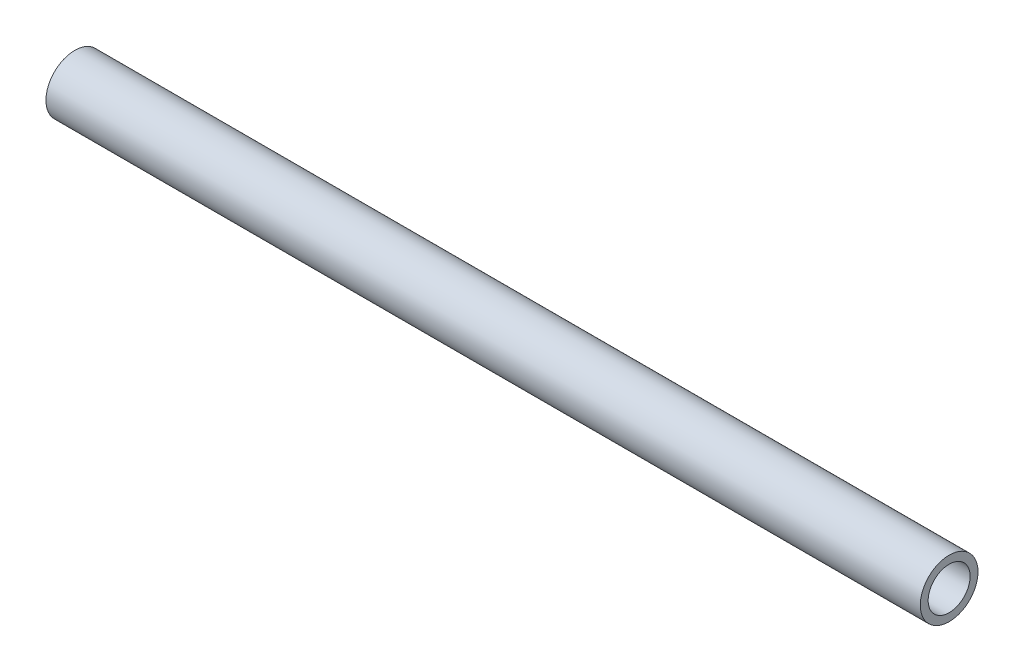
ISO-10303-21;
HEADER;
FILE_DESCRIPTION(('STEP AP214'),'2;1');
FILE_NAME('part.step','',(''),(''),'','','');
FILE_SCHEMA(('AUTOMOTIVE_DESIGN { 1 0 10303 214 1 1 1 1 }'));
ENDSEC;
DATA;
#1=APPLICATION_CONTEXT('core data for automotive mechanical design processes');
#2=APPLICATION_PROTOCOL_DEFINITION('international standard','automotive_design',2000,#1);
#3=PRODUCT_CONTEXT('',#1,'mechanical');
#4=PRODUCT('Part','Part','',(#3));
#5=PRODUCT_RELATED_PRODUCT_CATEGORY('part','',(#4));
#6=PRODUCT_DEFINITION_FORMATION('','',#4);
#7=PRODUCT_DEFINITION_CONTEXT('part definition',#1,'design');
#8=PRODUCT_DEFINITION('design','',#6,#7);
#9=PRODUCT_DEFINITION_SHAPE('','',#8);
#10=(LENGTH_UNIT() NAMED_UNIT(*) SI_UNIT(.MILLI.,.METRE.));
#11=(NAMED_UNIT(*) PLANE_ANGLE_UNIT() SI_UNIT($,.RADIAN.));
#12=(NAMED_UNIT(*) SI_UNIT($,.STERADIAN.) SOLID_ANGLE_UNIT());
#13=UNCERTAINTY_MEASURE_WITH_UNIT(LENGTH_MEASURE(1.E-05),#10,'distance_accuracy_value','');
#14=(GEOMETRIC_REPRESENTATION_CONTEXT(3) GLOBAL_UNCERTAINTY_ASSIGNED_CONTEXT((#13)) GLOBAL_UNIT_ASSIGNED_CONTEXT((#10,
#11,#12)) REPRESENTATION_CONTEXT('',''));
#15=CARTESIAN_POINT('',(0.,0.,0.));
#16=DIRECTION('',(0.,0.,1.));
#17=DIRECTION('',(1.,0.,0.));
#18=AXIS2_PLACEMENT_3D('',#15,#16,#17);
#19=CARTESIAN_POINT('',(125.,0.,0.));
#20=DIRECTION('',(1.,0.,0.));
#21=DIRECTION('',(0.,0.,-1.));
#22=AXIS2_PLACEMENT_3D('',#19,#20,#21);
#23=PLANE('',#22);
#24=CARTESIAN_POINT('',(125.,0.,0.));
#25=DIRECTION('',(1.,0.,0.));
#26=DIRECTION('',(0.,0.,-1.));
#27=AXIS2_PLACEMENT_3D('',#24,#25,#26);
#28=CIRCLE('',#27,4.125);
#29=CARTESIAN_POINT('',(125.,0.,-4.125));
#30=VERTEX_POINT('',#29);
#31=EDGE_CURVE('E10',#30,#30,#28,.T.);
#32=ORIENTED_EDGE('',*,*,#31,.T.);
#33=EDGE_LOOP('',(#32));
#34=FACE_BOUND('',#33,.T.);
#35=CARTESIAN_POINT('',(125.,0.,0.));
#36=DIRECTION('',(1.,0.,0.));
#37=DIRECTION('',(0.,0.,-1.));
#38=AXIS2_PLACEMENT_3D('',#35,#36,#37);
#39=CIRCLE('',#38,3.);
#40=CARTESIAN_POINT('',(125.,0.,-3.));
#41=VERTEX_POINT('',#40);
#42=EDGE_CURVE('E42',#41,#41,#39,.T.);
#43=ORIENTED_EDGE('',*,*,#42,.F.);
#44=EDGE_LOOP('',(#43));
#45=FACE_BOUND('',#44,.T.);
#46=ADVANCED_FACE('F31',(#34,#45),#23,.T.);
#47=CARTESIAN_POINT('',(0.,0.,0.));
#48=DIRECTION('',(1.,0.,0.));
#49=DIRECTION('',(0.,0.,-1.));
#50=AXIS2_PLACEMENT_3D('',#47,#48,#49);
#51=PLANE('',#50);
#52=CARTESIAN_POINT('',(0.,0.,0.));
#53=DIRECTION('',(1.,0.,0.));
#54=DIRECTION('',(0.,0.,-1.));
#55=AXIS2_PLACEMENT_3D('',#52,#53,#54);
#56=CIRCLE('',#55,4.125);
#57=CARTESIAN_POINT('',(0.,0.,-4.125));
#58=VERTEX_POINT('',#57);
#59=EDGE_CURVE('E35',#58,#58,#56,.T.);
#60=ORIENTED_EDGE('',*,*,#59,.F.);
#61=EDGE_LOOP('',(#60));
#62=FACE_BOUND('',#61,.T.);
#63=CARTESIAN_POINT('',(0.,0.,0.));
#64=DIRECTION('',(1.,0.,0.));
#65=DIRECTION('',(0.,0.,-1.));
#66=AXIS2_PLACEMENT_3D('',#63,#64,#65);
#67=CIRCLE('',#66,3.);
#68=CARTESIAN_POINT('',(0.,0.,-3.));
#69=VERTEX_POINT('',#68);
#70=EDGE_CURVE('E44',#69,#69,#67,.T.);
#71=ORIENTED_EDGE('',*,*,#70,.T.);
#72=EDGE_LOOP('',(#71));
#73=FACE_BOUND('',#72,.T.);
#74=ADVANCED_FACE('F54',(#62,#73),#51,.F.);
#75=CARTESIAN_POINT('',(125.,0.,0.));
#76=DIRECTION('',(-1.,0.,0.));
#77=DIRECTION('',(0.,0.,1.));
#78=AXIS2_PLACEMENT_3D('',#75,#76,#77);
#79=CYLINDRICAL_SURFACE('',#78,4.125);
#80=ORIENTED_EDGE('',*,*,#31,.F.);
#81=EDGE_LOOP('',(#80));
#82=FACE_BOUND('',#81,.T.);
#83=ORIENTED_EDGE('',*,*,#59,.T.);
#84=EDGE_LOOP('',(#83));
#85=FACE_BOUND('',#84,.T.);
#86=ADVANCED_FACE('F33',(#82,#85),#79,.T.);
#87=CARTESIAN_POINT('',(125.,0.,0.));
#88=DIRECTION('',(-1.,0.,0.));
#89=DIRECTION('',(0.,0.,1.));
#90=AXIS2_PLACEMENT_3D('',#87,#88,#89);
#91=CYLINDRICAL_SURFACE('',#90,3.);
#92=ORIENTED_EDGE('',*,*,#42,.T.);
#93=EDGE_LOOP('',(#92));
#94=FACE_BOUND('',#93,.T.);
#95=ORIENTED_EDGE('',*,*,#70,.F.);
#96=EDGE_LOOP('',(#95));
#97=FACE_BOUND('',#96,.T.);
#98=ADVANCED_FACE('F50',(#94,#97),#91,.F.);
#99=CLOSED_SHELL('',(#46,#74,#86,#98));
#100=MANIFOLD_SOLID_BREP('B2',#99);
#101=ADVANCED_BREP_SHAPE_REPRESENTATION('',(#18,#100),#14);
#102=SHAPE_DEFINITION_REPRESENTATION(#9,#101);
ENDSEC;
END-ISO-10303-21;
